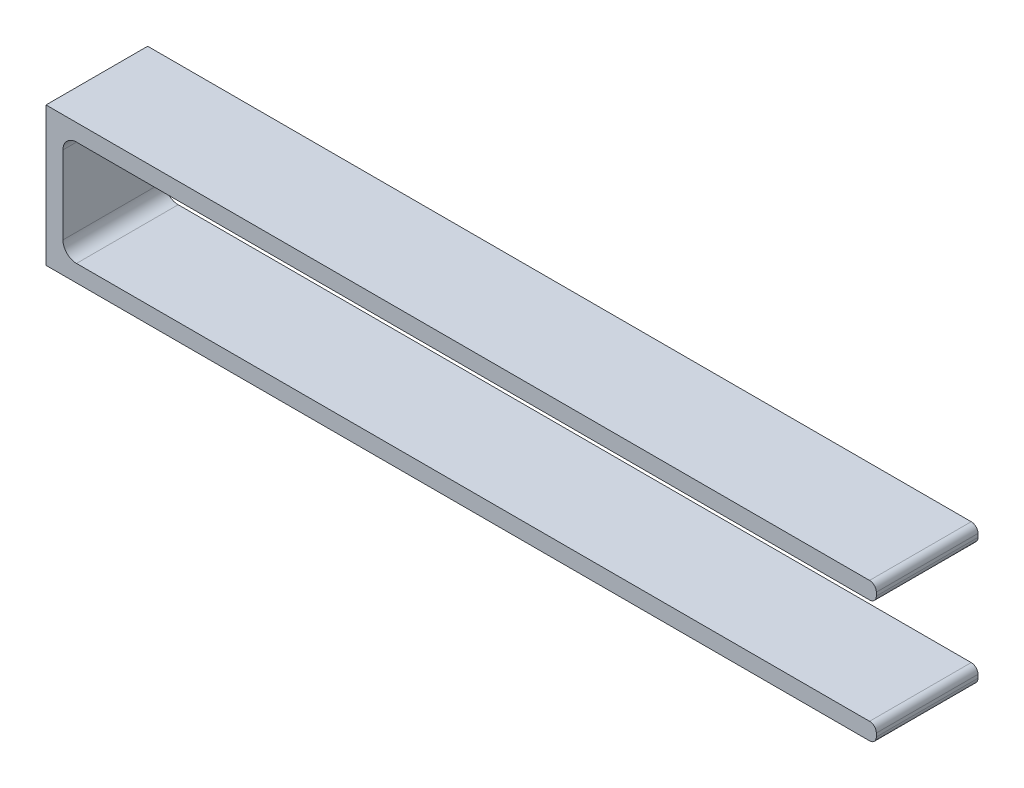
ISO-10303-21;
HEADER;
FILE_DESCRIPTION(('STEP AP214'),'2;1');
FILE_NAME('part.step','',(''),(''),'','','');
FILE_SCHEMA(('AUTOMOTIVE_DESIGN { 1 0 10303 214 1 1 1 1 }'));
ENDSEC;
DATA;
#1=APPLICATION_CONTEXT('core data for automotive mechanical design processes');
#2=APPLICATION_PROTOCOL_DEFINITION('international standard','automotive_design',2000,#1);
#3=PRODUCT_CONTEXT('',#1,'mechanical');
#4=PRODUCT('Part','Part','',(#3));
#5=PRODUCT_RELATED_PRODUCT_CATEGORY('part','',(#4));
#6=PRODUCT_DEFINITION_FORMATION('','',#4);
#7=PRODUCT_DEFINITION_CONTEXT('part definition',#1,'design');
#8=PRODUCT_DEFINITION('design','',#6,#7);
#9=PRODUCT_DEFINITION_SHAPE('','',#8);
#10=(LENGTH_UNIT() NAMED_UNIT(*) SI_UNIT(.MILLI.,.METRE.));
#11=(NAMED_UNIT(*) PLANE_ANGLE_UNIT() SI_UNIT($,.RADIAN.));
#12=(NAMED_UNIT(*) SI_UNIT($,.STERADIAN.) SOLID_ANGLE_UNIT());
#13=UNCERTAINTY_MEASURE_WITH_UNIT(LENGTH_MEASURE(1.E-05),#10,'distance_accuracy_value','');
#14=(GEOMETRIC_REPRESENTATION_CONTEXT(3) GLOBAL_UNCERTAINTY_ASSIGNED_CONTEXT((#13)) GLOBAL_UNIT_ASSIGNED_CONTEXT((#10,
#11,#12)) REPRESENTATION_CONTEXT('',''));
#15=CARTESIAN_POINT('',(0.,0.,0.));
#16=DIRECTION('',(0.,0.,1.));
#17=DIRECTION('',(1.,0.,0.));
#18=AXIS2_PLACEMENT_3D('',#15,#16,#17);
#19=CARTESIAN_POINT('',(0.,0.,15.));
#20=DIRECTION('',(0.,-1.,0.));
#21=DIRECTION('',(0.,0.,-1.));
#22=AXIS2_PLACEMENT_3D('',#19,#20,#21);
#23=PLANE('',#22);
#24=DIRECTION('',(-1.,0.,0.));
#25=VECTOR('',#24,1.);
#26=CARTESIAN_POINT('',(0.,0.,0.));
#27=LINE('',#26,#25);
#28=CARTESIAN_POINT('',(119.,0.,0.));
#29=VERTEX_POINT('',#28);
#30=CARTESIAN_POINT('',(2.,0.,0.));
#31=VERTEX_POINT('',#30);
#32=EDGE_CURVE('E195',#29,#31,#27,.T.);
#33=ORIENTED_EDGE('',*,*,#32,.T.);
#34=DIRECTION('',(0.,0.,-1.));
#35=VECTOR('',#34,1.);
#36=CARTESIAN_POINT('',(2.,0.,15.));
#37=LINE('',#36,#35);
#38=CARTESIAN_POINT('',(2.,0.,15.));
#39=VERTEX_POINT('',#38);
#40=EDGE_CURVE('E272',#31,#39,#37,.F.);
#41=ORIENTED_EDGE('',*,*,#40,.T.);
#42=DIRECTION('',(-1.,0.,0.));
#43=VECTOR('',#42,1.);
#44=CARTESIAN_POINT('',(0.,0.,15.));
#45=LINE('',#44,#43);
#46=CARTESIAN_POINT('',(119.,0.,15.));
#47=VERTEX_POINT('',#46);
#48=EDGE_CURVE('E232',#47,#39,#45,.T.);
#49=ORIENTED_EDGE('',*,*,#48,.F.);
#50=DIRECTION('',(0.,0.,-1.));
#51=VECTOR('',#50,1.);
#52=CARTESIAN_POINT('',(119.,0.,15.));
#53=LINE('',#52,#51);
#54=EDGE_CURVE('E194',#47,#29,#53,.T.);
#55=ORIENTED_EDGE('',*,*,#54,.T.);
#56=EDGE_LOOP('',(#33,#41,#49,#55));
#57=FACE_BOUND('',#56,.T.);
#58=ADVANCED_FACE('F43',(#57),#23,.F.);
#59=CARTESIAN_POINT('',(0.,0.,15.));
#60=DIRECTION('',(-1.,0.,0.));
#61=DIRECTION('',(0.,0.,1.));
#62=AXIS2_PLACEMENT_3D('',#59,#60,#61);
#63=PLANE('',#62);
#64=DIRECTION('',(0.,1.,0.));
#65=VECTOR('',#64,1.);
#66=CARTESIAN_POINT('',(0.,0.,15.));
#67=LINE('',#66,#65);
#68=CARTESIAN_POINT('',(0.,2.,15.));
#69=VERTEX_POINT('',#68);
#70=CARTESIAN_POINT('',(0.,13.5,15.));
#71=VERTEX_POINT('',#70);
#72=EDGE_CURVE('E150',#69,#71,#67,.T.);
#73=ORIENTED_EDGE('',*,*,#72,.F.);
#74=DIRECTION('',(0.,0.,-1.));
#75=VECTOR('',#74,1.);
#76=CARTESIAN_POINT('',(0.,2.,0.));
#77=LINE('',#76,#75);
#78=CARTESIAN_POINT('',(0.,2.,0.));
#79=VERTEX_POINT('',#78);
#80=EDGE_CURVE('E268',#69,#79,#77,.T.);
#81=ORIENTED_EDGE('',*,*,#80,.T.);
#82=DIRECTION('',(0.,1.,0.));
#83=VECTOR('',#82,1.);
#84=CARTESIAN_POINT('',(0.,0.,0.));
#85=LINE('',#84,#83);
#86=CARTESIAN_POINT('',(0.,13.5,0.));
#87=VERTEX_POINT('',#86);
#88=EDGE_CURVE('E199',#79,#87,#85,.T.);
#89=ORIENTED_EDGE('',*,*,#88,.T.);
#90=DIRECTION('',(0.,0.,-1.));
#91=VECTOR('',#90,1.);
#92=CARTESIAN_POINT('',(0.,13.5,15.));
#93=LINE('',#92,#91);
#94=EDGE_CURVE('E160',#87,#71,#93,.F.);
#95=ORIENTED_EDGE('',*,*,#94,.T.);
#96=EDGE_LOOP('',(#73,#81,#89,#95));
#97=FACE_BOUND('',#96,.T.);
#98=ADVANCED_FACE('F290',(#97),#63,.F.);
#99=CARTESIAN_POINT('',(0.,15.5,15.));
#100=DIRECTION('',(0.,1.,0.));
#101=DIRECTION('',(-1.,0.,0.));
#102=AXIS2_PLACEMENT_3D('',#99,#100,#101);
#103=PLANE('',#102);
#104=DIRECTION('',(1.,0.,0.));
#105=VECTOR('',#104,1.);
#106=CARTESIAN_POINT('',(0.,15.5,15.));
#107=LINE('',#106,#105);
#108=CARTESIAN_POINT('',(2.,15.5,15.));
#109=VERTEX_POINT('',#108);
#110=CARTESIAN_POINT('',(119.,15.5,15.));
#111=VERTEX_POINT('',#110);
#112=EDGE_CURVE('E141',#109,#111,#107,.T.);
#113=ORIENTED_EDGE('',*,*,#112,.F.);
#114=DIRECTION('',(0.,0.,-1.));
#115=VECTOR('',#114,1.);
#116=CARTESIAN_POINT('',(2.,15.5,0.));
#117=LINE('',#116,#115);
#118=CARTESIAN_POINT('',(2.,15.5,0.));
#119=VERTEX_POINT('',#118);
#120=EDGE_CURVE('E275',#109,#119,#117,.T.);
#121=ORIENTED_EDGE('',*,*,#120,.T.);
#122=DIRECTION('',(1.,0.,0.));
#123=VECTOR('',#122,1.);
#124=CARTESIAN_POINT('',(0.,15.5,0.));
#125=LINE('',#124,#123);
#126=CARTESIAN_POINT('',(119.,15.5,0.));
#127=VERTEX_POINT('',#126);
#128=EDGE_CURVE('E156',#119,#127,#125,.T.);
#129=ORIENTED_EDGE('',*,*,#128,.T.);
#130=DIRECTION('',(0.,0.,-1.));
#131=VECTOR('',#130,1.);
#132=CARTESIAN_POINT('',(119.,15.5,15.));
#133=LINE('',#132,#131);
#134=EDGE_CURVE('E153',#111,#127,#133,.T.);
#135=ORIENTED_EDGE('',*,*,#134,.F.);
#136=EDGE_LOOP('',(#113,#121,#129,#135));
#137=FACE_BOUND('',#136,.T.);
#138=ADVANCED_FACE('F154',(#137),#103,.F.);
#139=CARTESIAN_POINT('',(119.,16.5,15.));
#140=DIRECTION('',(0.,0.,-1.));
#141=DIRECTION('',(-1.,0.,0.));
#142=AXIS2_PLACEMENT_3D('',#139,#140,#141);
#143=CYLINDRICAL_SURFACE('',#142,1.);
#144=CARTESIAN_POINT('',(119.,16.5,0.));
#145=DIRECTION('',(0.,0.,1.));
#146=DIRECTION('',(1.,0.,0.));
#147=AXIS2_PLACEMENT_3D('',#144,#145,#146);
#148=CIRCLE('',#147,1.);
#149=CARTESIAN_POINT('',(120.,16.5,0.));
#150=VERTEX_POINT('',#149);
#151=EDGE_CURVE('E205',#127,#150,#148,.T.);
#152=ORIENTED_EDGE('',*,*,#151,.T.);
#153=DIRECTION('',(0.,0.,-1.));
#154=VECTOR('',#153,1.);
#155=CARTESIAN_POINT('',(120.,16.5,15.));
#156=LINE('',#155,#154);
#157=CARTESIAN_POINT('',(120.,16.5,15.));
#158=VERTEX_POINT('',#157);
#159=EDGE_CURVE('E161',#158,#150,#156,.T.);
#160=ORIENTED_EDGE('',*,*,#159,.F.);
#161=CARTESIAN_POINT('',(119.,16.5,15.));
#162=DIRECTION('',(0.,0.,1.));
#163=DIRECTION('',(1.,0.,0.));
#164=AXIS2_PLACEMENT_3D('',#161,#162,#163);
#165=CIRCLE('',#164,1.);
#166=EDGE_CURVE('E146',#111,#158,#165,.T.);
#167=ORIENTED_EDGE('',*,*,#166,.F.);
#168=ORIENTED_EDGE('',*,*,#134,.T.);
#169=EDGE_LOOP('',(#152,#160,#167,#168));
#170=FACE_BOUND('',#169,.T.);
#171=ADVANCED_FACE('F163',(#170),#143,.T.);
#172=CARTESIAN_POINT('',(120.,17.,15.));
#173=DIRECTION('',(-1.,0.,0.));
#174=DIRECTION('',(0.,0.,1.));
#175=AXIS2_PLACEMENT_3D('',#172,#173,#174);
#176=PLANE('',#175);
#177=DIRECTION('',(0.,1.,0.));
#178=VECTOR('',#177,1.);
#179=CARTESIAN_POINT('',(120.,17.,0.));
#180=LINE('',#179,#178);
#181=CARTESIAN_POINT('',(120.,17.,0.));
#182=VERTEX_POINT('',#181);
#183=EDGE_CURVE('E208',#150,#182,#180,.T.);
#184=ORIENTED_EDGE('',*,*,#183,.T.);
#185=DIRECTION('',(0.,0.,-1.));
#186=VECTOR('',#185,1.);
#187=CARTESIAN_POINT('',(120.,17.,15.));
#188=LINE('',#187,#186);
#189=CARTESIAN_POINT('',(120.,17.,15.));
#190=VERTEX_POINT('',#189);
#191=EDGE_CURVE('E260',#190,#182,#188,.T.);
#192=ORIENTED_EDGE('',*,*,#191,.F.);
#193=DIRECTION('',(0.,1.,0.));
#194=VECTOR('',#193,1.);
#195=CARTESIAN_POINT('',(120.,17.,15.));
#196=LINE('',#195,#194);
#197=EDGE_CURVE('E167',#158,#190,#196,.T.);
#198=ORIENTED_EDGE('',*,*,#197,.F.);
#199=ORIENTED_EDGE('',*,*,#159,.T.);
#200=EDGE_LOOP('',(#184,#192,#198,#199));
#201=FACE_BOUND('',#200,.T.);
#202=ADVANCED_FACE('F310',(#201),#176,.F.);
#203=CARTESIAN_POINT('',(119.,17.,15.));
#204=DIRECTION('',(0.,0.,-1.));
#205=DIRECTION('',(-1.,0.,0.));
#206=AXIS2_PLACEMENT_3D('',#203,#204,#205);
#207=CYLINDRICAL_SURFACE('',#206,0.999999999999999);
#208=CARTESIAN_POINT('',(119.,17.,0.));
#209=DIRECTION('',(0.,0.,1.));
#210=DIRECTION('',(1.,0.,0.));
#211=AXIS2_PLACEMENT_3D('',#208,#209,#210);
#212=CIRCLE('',#211,0.999999999999999);
#213=CARTESIAN_POINT('',(119.,18.,0.));
#214=VERTEX_POINT('',#213);
#215=EDGE_CURVE('E211',#182,#214,#212,.T.);
#216=ORIENTED_EDGE('',*,*,#215,.T.);
#217=DIRECTION('',(0.,0.,-1.));
#218=VECTOR('',#217,1.);
#219=CARTESIAN_POINT('',(119.,18.,15.));
#220=LINE('',#219,#218);
#221=CARTESIAN_POINT('',(119.,18.,15.));
#222=VERTEX_POINT('',#221);
#223=EDGE_CURVE('E256',#222,#214,#220,.T.);
#224=ORIENTED_EDGE('',*,*,#223,.F.);
#225=CARTESIAN_POINT('',(119.,17.,15.));
#226=DIRECTION('',(0.,0.,1.));
#227=DIRECTION('',(1.,0.,0.));
#228=AXIS2_PLACEMENT_3D('',#225,#226,#227);
#229=CIRCLE('',#228,0.999999999999999);
#230=EDGE_CURVE('E170',#190,#222,#229,.T.);
#231=ORIENTED_EDGE('',*,*,#230,.F.);
#232=ORIENTED_EDGE('',*,*,#191,.T.);
#233=EDGE_LOOP('',(#216,#224,#231,#232));
#234=FACE_BOUND('',#233,.T.);
#235=ADVANCED_FACE('F313',(#234),#207,.T.);
#236=CARTESIAN_POINT('',(-2.5,18.,15.));
#237=DIRECTION('',(0.,-1.,0.));
#238=DIRECTION('',(1.,0.,0.));
#239=AXIS2_PLACEMENT_3D('',#236,#237,#238);
#240=PLANE('',#239);
#241=DIRECTION('',(-1.,0.,0.));
#242=VECTOR('',#241,1.);
#243=CARTESIAN_POINT('',(-2.5,18.,0.));
#244=LINE('',#243,#242);
#245=CARTESIAN_POINT('',(-2.5,18.,0.));
#246=VERTEX_POINT('',#245);
#247=EDGE_CURVE('E214',#214,#246,#244,.T.);
#248=ORIENTED_EDGE('',*,*,#247,.T.);
#249=DIRECTION('',(0.,0.,-1.));
#250=VECTOR('',#249,1.);
#251=CARTESIAN_POINT('',(-2.5,18.,15.));
#252=LINE('',#251,#250);
#253=CARTESIAN_POINT('',(-2.5,18.,15.));
#254=VERTEX_POINT('',#253);
#255=EDGE_CURVE('E252',#254,#246,#252,.T.);
#256=ORIENTED_EDGE('',*,*,#255,.F.);
#257=DIRECTION('',(-1.,0.,0.));
#258=VECTOR('',#257,1.);
#259=CARTESIAN_POINT('',(-2.5,18.,15.));
#260=LINE('',#259,#258);
#261=EDGE_CURVE('E176',#222,#254,#260,.T.);
#262=ORIENTED_EDGE('',*,*,#261,.F.);
#263=ORIENTED_EDGE('',*,*,#223,.T.);
#264=EDGE_LOOP('',(#248,#256,#262,#263));
#265=FACE_BOUND('',#264,.T.);
#266=ADVANCED_FACE('F317',(#265),#240,.F.);
#267=CARTESIAN_POINT('',(-2.5,-2.5,15.));
#268=DIRECTION('',(1.,0.,0.));
#269=DIRECTION('',(0.,0.,-1.));
#270=AXIS2_PLACEMENT_3D('',#267,#268,#269);
#271=PLANE('',#270);
#272=DIRECTION('',(0.,-1.,0.));
#273=VECTOR('',#272,1.);
#274=CARTESIAN_POINT('',(-2.5,-2.5,0.));
#275=LINE('',#274,#273);
#276=CARTESIAN_POINT('',(-2.5,-2.5,0.));
#277=VERTEX_POINT('',#276);
#278=EDGE_CURVE('E217',#246,#277,#275,.T.);
#279=ORIENTED_EDGE('',*,*,#278,.T.);
#280=DIRECTION('',(0.,0.,-1.));
#281=VECTOR('',#280,1.);
#282=CARTESIAN_POINT('',(-2.5,-2.5,15.));
#283=LINE('',#282,#281);
#284=CARTESIAN_POINT('',(-2.5,-2.5,15.));
#285=VERTEX_POINT('',#284);
#286=EDGE_CURVE('E248',#285,#277,#283,.T.);
#287=ORIENTED_EDGE('',*,*,#286,.F.);
#288=DIRECTION('',(0.,-1.,0.));
#289=VECTOR('',#288,1.);
#290=CARTESIAN_POINT('',(-2.5,-2.5,15.));
#291=LINE('',#290,#289);
#292=EDGE_CURVE('E179',#254,#285,#291,.T.);
#293=ORIENTED_EDGE('',*,*,#292,.F.);
#294=ORIENTED_EDGE('',*,*,#255,.T.);
#295=EDGE_LOOP('',(#279,#287,#293,#294));
#296=FACE_BOUND('',#295,.T.);
#297=ADVANCED_FACE('F321',(#296),#271,.F.);
#298=CARTESIAN_POINT('',(-2.5,-2.5,15.));
#299=DIRECTION('',(0.,1.,0.));
#300=DIRECTION('',(0.,0.,1.));
#301=AXIS2_PLACEMENT_3D('',#298,#299,#300);
#302=PLANE('',#301);
#303=DIRECTION('',(1.,0.,0.));
#304=VECTOR('',#303,1.);
#305=CARTESIAN_POINT('',(-2.5,-2.5,0.));
#306=LINE('',#305,#304);
#307=CARTESIAN_POINT('',(119.,-2.5,0.));
#308=VERTEX_POINT('',#307);
#309=EDGE_CURVE('E220',#277,#308,#306,.T.);
#310=ORIENTED_EDGE('',*,*,#309,.T.);
#311=DIRECTION('',(0.,0.,-1.));
#312=VECTOR('',#311,1.);
#313=CARTESIAN_POINT('',(119.,-2.5,15.));
#314=LINE('',#313,#312);
#315=CARTESIAN_POINT('',(119.,-2.5,15.));
#316=VERTEX_POINT('',#315);
#317=EDGE_CURVE('E244',#316,#308,#314,.T.);
#318=ORIENTED_EDGE('',*,*,#317,.F.);
#319=DIRECTION('',(1.,0.,0.));
#320=VECTOR('',#319,1.);
#321=CARTESIAN_POINT('',(-2.5,-2.5,15.));
#322=LINE('',#321,#320);
#323=EDGE_CURVE('E182',#285,#316,#322,.T.);
#324=ORIENTED_EDGE('',*,*,#323,.F.);
#325=ORIENTED_EDGE('',*,*,#286,.T.);
#326=EDGE_LOOP('',(#310,#318,#324,#325));
#327=FACE_BOUND('',#326,.T.);
#328=ADVANCED_FACE('F325',(#327),#302,.F.);
#329=CARTESIAN_POINT('',(119.,-1.5,15.));
#330=DIRECTION('',(0.,0.,-1.));
#331=DIRECTION('',(-1.,0.,0.));
#332=AXIS2_PLACEMENT_3D('',#329,#330,#331);
#333=CYLINDRICAL_SURFACE('',#332,1.);
#334=CARTESIAN_POINT('',(119.,-1.5,0.));
#335=DIRECTION('',(0.,0.,1.));
#336=DIRECTION('',(-1.,0.,0.));
#337=AXIS2_PLACEMENT_3D('',#334,#335,#336);
#338=CIRCLE('',#337,1.);
#339=CARTESIAN_POINT('',(120.,-1.49999999999999,0.));
#340=VERTEX_POINT('',#339);
#341=EDGE_CURVE('E223',#308,#340,#338,.T.);
#342=ORIENTED_EDGE('',*,*,#341,.T.);
#343=DIRECTION('',(0.,0.,-1.));
#344=VECTOR('',#343,1.);
#345=CARTESIAN_POINT('',(120.,-1.49999999999999,15.));
#346=LINE('',#345,#344);
#347=CARTESIAN_POINT('',(120.,-1.49999999999999,15.));
#348=VERTEX_POINT('',#347);
#349=EDGE_CURVE('E240',#348,#340,#346,.T.);
#350=ORIENTED_EDGE('',*,*,#349,.F.);
#351=CARTESIAN_POINT('',(119.,-1.5,15.));
#352=DIRECTION('',(0.,0.,1.));
#353=DIRECTION('',(-1.,0.,0.));
#354=AXIS2_PLACEMENT_3D('',#351,#352,#353);
#355=CIRCLE('',#354,1.);
#356=EDGE_CURVE('E185',#316,#348,#355,.T.);
#357=ORIENTED_EDGE('',*,*,#356,.F.);
#358=ORIENTED_EDGE('',*,*,#317,.T.);
#359=EDGE_LOOP('',(#342,#350,#357,#358));
#360=FACE_BOUND('',#359,.T.);
#361=ADVANCED_FACE('F329',(#360),#333,.T.);
#362=CARTESIAN_POINT('',(120.,-1.00000000000001,15.));
#363=DIRECTION('',(-1.,0.,0.));
#364=DIRECTION('',(0.,0.,1.));
#365=AXIS2_PLACEMENT_3D('',#362,#363,#364);
#366=PLANE('',#365);
#367=DIRECTION('',(0.,1.,0.));
#368=VECTOR('',#367,1.);
#369=CARTESIAN_POINT('',(120.,-1.00000000000001,0.));
#370=LINE('',#369,#368);
#371=CARTESIAN_POINT('',(120.,-1.00000000000001,0.));
#372=VERTEX_POINT('',#371);
#373=EDGE_CURVE('E226',#340,#372,#370,.T.);
#374=ORIENTED_EDGE('',*,*,#373,.T.);
#375=DIRECTION('',(0.,0.,-1.));
#376=VECTOR('',#375,1.);
#377=CARTESIAN_POINT('',(120.,-1.00000000000001,15.));
#378=LINE('',#377,#376);
#379=CARTESIAN_POINT('',(120.,-1.00000000000001,15.));
#380=VERTEX_POINT('',#379);
#381=EDGE_CURVE('E236',#380,#372,#378,.T.);
#382=ORIENTED_EDGE('',*,*,#381,.F.);
#383=DIRECTION('',(0.,1.,0.));
#384=VECTOR('',#383,1.);
#385=CARTESIAN_POINT('',(120.,-1.00000000000001,15.));
#386=LINE('',#385,#384);
#387=EDGE_CURVE('E188',#348,#380,#386,.T.);
#388=ORIENTED_EDGE('',*,*,#387,.F.);
#389=ORIENTED_EDGE('',*,*,#349,.T.);
#390=EDGE_LOOP('',(#374,#382,#388,#389));
#391=FACE_BOUND('',#390,.T.);
#392=ADVANCED_FACE('F333',(#391),#366,.F.);
#393=CARTESIAN_POINT('',(119.,-1.,15.));
#394=DIRECTION('',(0.,0.,-1.));
#395=DIRECTION('',(-1.,0.,0.));
#396=AXIS2_PLACEMENT_3D('',#393,#394,#395);
#397=CYLINDRICAL_SURFACE('',#396,1.);
#398=CARTESIAN_POINT('',(119.,-1.,0.));
#399=DIRECTION('',(0.,0.,1.));
#400=DIRECTION('',(1.,0.,0.));
#401=AXIS2_PLACEMENT_3D('',#398,#399,#400);
#402=CIRCLE('',#401,1.);
#403=EDGE_CURVE('E229',#372,#29,#402,.T.);
#404=ORIENTED_EDGE('',*,*,#403,.T.);
#405=ORIENTED_EDGE('',*,*,#54,.F.);
#406=CARTESIAN_POINT('',(119.,-1.,15.));
#407=DIRECTION('',(0.,0.,1.));
#408=DIRECTION('',(1.,0.,0.));
#409=AXIS2_PLACEMENT_3D('',#406,#407,#408);
#410=CIRCLE('',#409,1.);
#411=EDGE_CURVE('E191',#380,#47,#410,.T.);
#412=ORIENTED_EDGE('',*,*,#411,.F.);
#413=ORIENTED_EDGE('',*,*,#381,.T.);
#414=EDGE_LOOP('',(#404,#405,#412,#413));
#415=FACE_BOUND('',#414,.T.);
#416=ADVANCED_FACE('F337',(#415),#397,.T.);
#417=CARTESIAN_POINT('',(119.,-1.,15.));
#418=DIRECTION('',(0.,0.,1.));
#419=DIRECTION('',(1.,0.,0.));
#420=AXIS2_PLACEMENT_3D('',#417,#418,#419);
#421=PLANE('',#420);
#422=ORIENTED_EDGE('',*,*,#48,.T.);
#423=CARTESIAN_POINT('',(2.,2.,15.));
#424=DIRECTION('',(0.,0.,1.));
#425=DIRECTION('',(1.,0.,0.));
#426=AXIS2_PLACEMENT_3D('',#423,#424,#425);
#427=CIRCLE('',#426,2.);
#428=EDGE_CURVE('E281',#39,#69,#427,.F.);
#429=ORIENTED_EDGE('',*,*,#428,.T.);
#430=ORIENTED_EDGE('',*,*,#72,.T.);
#431=CARTESIAN_POINT('',(2.,13.5,15.));
#432=DIRECTION('',(0.,0.,1.));
#433=DIRECTION('',(1.,0.,0.));
#434=AXIS2_PLACEMENT_3D('',#431,#432,#433);
#435=CIRCLE('',#434,2.);
#436=EDGE_CURVE('E11',#71,#109,#435,.F.);
#437=ORIENTED_EDGE('',*,*,#436,.T.);
#438=ORIENTED_EDGE('',*,*,#112,.T.);
#439=ORIENTED_EDGE('',*,*,#166,.T.);
#440=ORIENTED_EDGE('',*,*,#197,.T.);
#441=ORIENTED_EDGE('',*,*,#230,.T.);
#442=ORIENTED_EDGE('',*,*,#261,.T.);
#443=ORIENTED_EDGE('',*,*,#292,.T.);
#444=ORIENTED_EDGE('',*,*,#323,.T.);
#445=ORIENTED_EDGE('',*,*,#356,.T.);
#446=ORIENTED_EDGE('',*,*,#387,.T.);
#447=ORIENTED_EDGE('',*,*,#411,.T.);
#448=EDGE_LOOP('',(#422,#429,#430,#437,#438,#439,#440,#441,#442,#443,#444,#445,#446,#447));
#449=FACE_BOUND('',#448,.T.);
#450=ADVANCED_FACE('F144',(#449),#421,.T.);
#451=CARTESIAN_POINT('',(119.,-1.,0.));
#452=DIRECTION('',(0.,0.,1.));
#453=DIRECTION('',(1.,0.,0.));
#454=AXIS2_PLACEMENT_3D('',#451,#452,#453);
#455=PLANE('',#454);
#456=ORIENTED_EDGE('',*,*,#32,.F.);
#457=ORIENTED_EDGE('',*,*,#403,.F.);
#458=ORIENTED_EDGE('',*,*,#373,.F.);
#459=ORIENTED_EDGE('',*,*,#341,.F.);
#460=ORIENTED_EDGE('',*,*,#309,.F.);
#461=ORIENTED_EDGE('',*,*,#278,.F.);
#462=ORIENTED_EDGE('',*,*,#247,.F.);
#463=ORIENTED_EDGE('',*,*,#215,.F.);
#464=ORIENTED_EDGE('',*,*,#183,.F.);
#465=ORIENTED_EDGE('',*,*,#151,.F.);
#466=ORIENTED_EDGE('',*,*,#128,.F.);
#467=CARTESIAN_POINT('',(2.,13.5,0.));
#468=DIRECTION('',(0.,0.,1.));
#469=DIRECTION('',(1.,0.,0.));
#470=AXIS2_PLACEMENT_3D('',#467,#468,#469);
#471=CIRCLE('',#470,2.);
#472=EDGE_CURVE('E52',#119,#87,#471,.T.);
#473=ORIENTED_EDGE('',*,*,#472,.T.);
#474=ORIENTED_EDGE('',*,*,#88,.F.);
#475=CARTESIAN_POINT('',(2.,2.,0.));
#476=DIRECTION('',(0.,0.,1.));
#477=DIRECTION('',(1.,0.,0.));
#478=AXIS2_PLACEMENT_3D('',#475,#476,#477);
#479=CIRCLE('',#478,2.);
#480=EDGE_CURVE('E278',#79,#31,#479,.T.);
#481=ORIENTED_EDGE('',*,*,#480,.T.);
#482=EDGE_LOOP('',(#456,#457,#458,#459,#460,#461,#462,#463,#464,#465,#466,#473,#474,#481));
#483=FACE_BOUND('',#482,.T.);
#484=ADVANCED_FACE('F287',(#483),#455,.F.);
#485=CARTESIAN_POINT('',(2.,2.,15.));
#486=DIRECTION('',(0.,0.,1.));
#487=DIRECTION('',(1.,0.,0.));
#488=AXIS2_PLACEMENT_3D('',#485,#486,#487);
#489=CYLINDRICAL_SURFACE('',#488,2.);
#490=ORIENTED_EDGE('',*,*,#428,.F.);
#491=ORIENTED_EDGE('',*,*,#40,.F.);
#492=ORIENTED_EDGE('',*,*,#480,.F.);
#493=ORIENTED_EDGE('',*,*,#80,.F.);
#494=EDGE_LOOP('',(#490,#491,#492,#493));
#495=FACE_BOUND('',#494,.T.);
#496=ADVANCED_FACE('F293',(#495),#489,.F.);
#497=CARTESIAN_POINT('',(2.,13.5,15.));
#498=DIRECTION('',(0.,0.,1.));
#499=DIRECTION('',(1.,0.,0.));
#500=AXIS2_PLACEMENT_3D('',#497,#498,#499);
#501=CYLINDRICAL_SURFACE('',#500,2.);
#502=ORIENTED_EDGE('',*,*,#436,.F.);
#503=ORIENTED_EDGE('',*,*,#94,.F.);
#504=ORIENTED_EDGE('',*,*,#472,.F.);
#505=ORIENTED_EDGE('',*,*,#120,.F.);
#506=EDGE_LOOP('',(#502,#503,#504,#505));
#507=FACE_BOUND('',#506,.T.);
#508=ADVANCED_FACE('F45',(#507),#501,.F.);
#509=CLOSED_SHELL('',(#58,#98,#138,#171,#202,#235,#266,#297,#328,#361,#392,#416,#450,#484,#496,#508));
#510=MANIFOLD_SOLID_BREP('B2',#509);
#511=ADVANCED_BREP_SHAPE_REPRESENTATION('',(#18,#510),#14);
#512=SHAPE_DEFINITION_REPRESENTATION(#9,#511);
ENDSEC;
END-ISO-10303-21;
